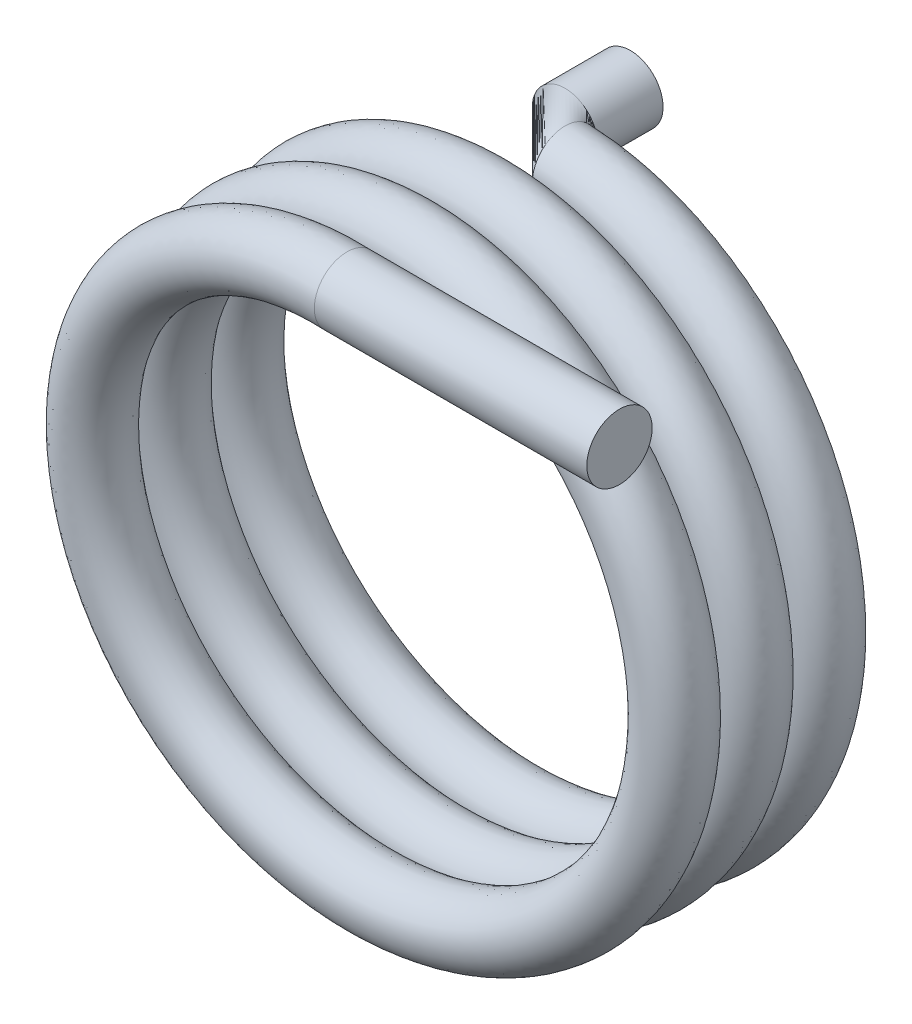
ISO-10303-21;
HEADER;
FILE_DESCRIPTION(('STEP AP214'),'2;1');
FILE_NAME('part.step','',(''),(''),'','','');
FILE_SCHEMA(('AUTOMOTIVE_DESIGN { 1 0 10303 214 1 1 1 1 }'));
ENDSEC;
DATA;
#1=APPLICATION_CONTEXT('core data for automotive mechanical design processes');
#2=APPLICATION_PROTOCOL_DEFINITION('international standard','automotive_design',2000,#1);
#3=PRODUCT_CONTEXT('',#1,'mechanical');
#4=PRODUCT('Part','Part','',(#3));
#5=PRODUCT_RELATED_PRODUCT_CATEGORY('part','',(#4));
#6=PRODUCT_DEFINITION_FORMATION('','',#4);
#7=PRODUCT_DEFINITION_CONTEXT('part definition',#1,'design');
#8=PRODUCT_DEFINITION('design','',#6,#7);
#9=PRODUCT_DEFINITION_SHAPE('','',#8);
#10=(LENGTH_UNIT() NAMED_UNIT(*) SI_UNIT(.MILLI.,.METRE.));
#11=(NAMED_UNIT(*) PLANE_ANGLE_UNIT() SI_UNIT($,.RADIAN.));
#12=(NAMED_UNIT(*) SI_UNIT($,.STERADIAN.) SOLID_ANGLE_UNIT());
#13=UNCERTAINTY_MEASURE_WITH_UNIT(LENGTH_MEASURE(1.E-05),#10,'distance_accuracy_value','');
#14=(GEOMETRIC_REPRESENTATION_CONTEXT(3) GLOBAL_UNCERTAINTY_ASSIGNED_CONTEXT((#13)) GLOBAL_UNIT_ASSIGNED_CONTEXT((#10,
#11,#12)) REPRESENTATION_CONTEXT('',''));
#15=CARTESIAN_POINT('',(0.,0.,0.));
#16=DIRECTION('',(0.,0.,1.));
#17=DIRECTION('',(1.,0.,0.));
#18=AXIS2_PLACEMENT_3D('',#15,#16,#17);
#19=CARTESIAN_POINT('',(0.,0.,-1.8));
#20=CARTESIAN_POINT('',(4.01923788646684,0.,-1.63333333333333));
#21=CARTESIAN_POINT('',(7.5,-2.00961894323342,-1.46666666666667));
#22=CARTESIAN_POINT('',(10.9807621135332,-4.01923788646684,-1.3));
#23=CARTESIAN_POINT('',(12.9903810567666,-7.5,-1.13333333333333));
#24=CARTESIAN_POINT('',(15.,-10.9807621135332,-0.966666666666667));
#25=CARTESIAN_POINT('',(15.,-15.,-0.8));
#26=CARTESIAN_POINT('',(15.,-19.0192378864668,-0.633333333333333));
#27=CARTESIAN_POINT('',(12.9903810567666,-22.5,-0.466666666666667));
#28=CARTESIAN_POINT('',(10.9807621135332,-25.9807621135332,-0.3));
#29=CARTESIAN_POINT('',(7.50000000000001,-27.9903810567666,-0.133333333333333));
#30=CARTESIAN_POINT('',(4.01923788646685,-30.,0.0333333333333333));
#31=CARTESIAN_POINT('',(0.,-30.,0.2));
#32=CARTESIAN_POINT('',(-4.01923788646683,-30.,0.366666666666667));
#33=CARTESIAN_POINT('',(-7.49999999999999,-27.9903810567666,0.533333333333333));
#34=CARTESIAN_POINT('',(-10.9807621135331,-25.9807621135332,0.7));
#35=CARTESIAN_POINT('',(-12.9903810567666,-22.5,0.866666666666667));
#36=CARTESIAN_POINT('',(-15.,-19.0192378864669,1.03333333333333));
#37=CARTESIAN_POINT('',(-15.,-15.,1.2));
#38=CARTESIAN_POINT('',(-15.,-10.9807621135332,1.36666666666667));
#39=CARTESIAN_POINT('',(-12.9903810567666,-7.50000000000001,1.53333333333333));
#40=CARTESIAN_POINT('',(-10.9807621135332,-4.01923788646684,1.7));
#41=CARTESIAN_POINT('',(-7.50000000000001,-2.00961894323343,1.86666666666667));
#42=CARTESIAN_POINT('',(-4.01923788646685,0.,2.03333333333333));
#43=CARTESIAN_POINT('',(0.,0.,2.2));
#44=CARTESIAN_POINT('',(4.01923788646684,0.,2.36666666666667));
#45=CARTESIAN_POINT('',(7.5,-2.00961894323342,2.53333333333333));
#46=CARTESIAN_POINT('',(10.9807621135332,-4.01923788646684,2.7));
#47=CARTESIAN_POINT('',(12.9903810567666,-7.5,2.86666666666667));
#48=CARTESIAN_POINT('',(15.,-10.9807621135332,3.03333333333333));
#49=CARTESIAN_POINT('',(15.,-15.,3.2));
#50=CARTESIAN_POINT('',(15.,-19.0192378864668,3.36666666666667));
#51=CARTESIAN_POINT('',(12.9903810567666,-22.5,3.53333333333333));
#52=CARTESIAN_POINT('',(10.9807621135332,-25.9807621135332,3.7));
#53=CARTESIAN_POINT('',(7.50000000000001,-27.9903810567666,3.86666666666667));
#54=CARTESIAN_POINT('',(4.01923788646685,-30.,4.03333333333333));
#55=CARTESIAN_POINT('',(0.,-30.,4.2));
#56=CARTESIAN_POINT('',(-4.01923788646683,-30.,4.36666666666667));
#57=CARTESIAN_POINT('',(-7.49999999999999,-27.9903810567666,4.53333333333333));
#58=CARTESIAN_POINT('',(-10.9807621135331,-25.9807621135332,4.7));
#59=CARTESIAN_POINT('',(-12.9903810567666,-22.5,4.86666666666667));
#60=CARTESIAN_POINT('',(-15.,-19.0192378864669,5.03333333333333));
#61=CARTESIAN_POINT('',(-15.,-15.,5.2));
#62=CARTESIAN_POINT('',(-15.,-10.9807621135332,5.36666666666667));
#63=CARTESIAN_POINT('',(-12.9903810567666,-7.50000000000001,5.53333333333333));
#64=CARTESIAN_POINT('',(-10.9807621135332,-4.01923788646684,5.7));
#65=CARTESIAN_POINT('',(-7.50000000000001,-2.00961894323343,5.86666666666667));
#66=CARTESIAN_POINT('',(-4.01923788646685,0.,6.03333333333333));
#67=CARTESIAN_POINT('',(0.,0.,6.2));
#68=CARTESIAN_POINT('',(4.01923788646684,0.,6.36666666666667));
#69=CARTESIAN_POINT('',(7.5,-2.00961894323342,6.53333333333333));
#70=CARTESIAN_POINT('',(10.9807621135332,-4.01923788646684,6.7));
#71=CARTESIAN_POINT('',(12.9903810567666,-7.5,6.86666666666667));
#72=CARTESIAN_POINT('',(15.,-10.9807621135332,7.03333333333333));
#73=CARTESIAN_POINT('',(15.,-15.,7.2));
#74=CARTESIAN_POINT('',(15.,-19.0192378864668,7.36666666666667));
#75=CARTESIAN_POINT('',(12.9903810567666,-22.5,7.53333333333333));
#76=CARTESIAN_POINT('',(10.9807621135332,-25.9807621135332,7.7));
#77=CARTESIAN_POINT('',(7.50000000000001,-27.9903810567666,7.86666666666667));
#78=CARTESIAN_POINT('',(4.01923788646685,-30.,8.03333333333333));
#79=CARTESIAN_POINT('',(0.,-30.,8.2));
#80=CARTESIAN_POINT('',(-4.01923788646683,-30.,8.36666666666667));
#81=CARTESIAN_POINT('',(-7.49999999999999,-27.9903810567666,8.53333333333333));
#82=CARTESIAN_POINT('',(-10.9807621135331,-25.9807621135332,8.7));
#83=CARTESIAN_POINT('',(-12.9903810567666,-22.5,8.86666666666667));
#84=CARTESIAN_POINT('',(-15.,-19.0192378864669,9.03333333333333));
#85=CARTESIAN_POINT('',(-15.,-15.,9.2));
#86=CARTESIAN_POINT('',(-15.,-10.9807621135332,9.36666666666667));
#87=CARTESIAN_POINT('',(-12.9903810567666,-7.50000000000001,9.53333333333333));
#88=CARTESIAN_POINT('',(-10.9807621135332,-4.01923788646684,9.7));
#89=CARTESIAN_POINT('',(-7.50000000000001,-2.00961894323343,9.86666666666667));
#90=CARTESIAN_POINT('',(-4.01923788646685,0.,10.0333333333333));
#91=CARTESIAN_POINT('',(0.,0.,10.2));
#92=CARTESIAN_POINT('',(0.,3.6,-1.8));
#93=CARTESIAN_POINT('',(4.98385497921888,3.6,-1.63333333333333));
#94=CARTESIAN_POINT('',(9.3,1.10807251039056,-1.46666666666667));
#95=CARTESIAN_POINT('',(13.6161450207811,-1.38385497921888,-1.3));
#96=CARTESIAN_POINT('',(16.1080725103906,-5.7,-1.13333333333333));
#97=CARTESIAN_POINT('',(18.6,-10.0161450207811,-0.966666666666667));
#98=CARTESIAN_POINT('',(18.6,-15.,-0.8));
#99=CARTESIAN_POINT('',(18.6,-19.9838549792189,-0.633333333333333));
#100=CARTESIAN_POINT('',(16.1080725103906,-24.3,-0.466666666666667));
#101=CARTESIAN_POINT('',(13.6161450207811,-28.6161450207811,-0.3));
#102=CARTESIAN_POINT('',(9.30000000000001,-31.1080725103906,-0.133333333333333));
#103=CARTESIAN_POINT('',(4.98385497921889,-33.6,0.0333333333333333));
#104=CARTESIAN_POINT('',(0.,-33.6,0.2));
#105=CARTESIAN_POINT('',(-4.98385497921887,-33.6,0.366666666666667));
#106=CARTESIAN_POINT('',(-9.29999999999999,-31.1080725103906,0.533333333333333));
#107=CARTESIAN_POINT('',(-13.6161450207811,-28.6161450207811,0.7));
#108=CARTESIAN_POINT('',(-16.1080725103905,-24.3,0.866666666666667));
#109=CARTESIAN_POINT('',(-18.6,-19.9838549792189,1.03333333333333));
#110=CARTESIAN_POINT('',(-18.6,-15.,1.2));
#111=CARTESIAN_POINT('',(-18.6,-10.0161450207811,1.36666666666667));
#112=CARTESIAN_POINT('',(-16.1080725103906,-5.70000000000002,1.53333333333333));
#113=CARTESIAN_POINT('',(-13.6161450207811,-1.38385497921889,1.7));
#114=CARTESIAN_POINT('',(-9.30000000000001,1.10807251039055,1.86666666666667));
#115=CARTESIAN_POINT('',(-4.9838549792189,3.6,2.03333333333333));
#116=CARTESIAN_POINT('',(0.,3.6,2.2));
#117=CARTESIAN_POINT('',(4.98385497921888,3.6,2.36666666666667));
#118=CARTESIAN_POINT('',(9.3,1.10807251039056,2.53333333333333));
#119=CARTESIAN_POINT('',(13.6161450207811,-1.38385497921888,2.7));
#120=CARTESIAN_POINT('',(16.1080725103906,-5.7,2.86666666666667));
#121=CARTESIAN_POINT('',(18.6,-10.0161450207811,3.03333333333333));
#122=CARTESIAN_POINT('',(18.6,-15.,3.2));
#123=CARTESIAN_POINT('',(18.6,-19.9838549792189,3.36666666666667));
#124=CARTESIAN_POINT('',(16.1080725103906,-24.3,3.53333333333333));
#125=CARTESIAN_POINT('',(13.6161450207811,-28.6161450207811,3.7));
#126=CARTESIAN_POINT('',(9.30000000000001,-31.1080725103906,3.86666666666667));
#127=CARTESIAN_POINT('',(4.98385497921889,-33.6,4.03333333333333));
#128=CARTESIAN_POINT('',(0.,-33.6,4.2));
#129=CARTESIAN_POINT('',(-4.98385497921887,-33.6,4.36666666666667));
#130=CARTESIAN_POINT('',(-9.29999999999999,-31.1080725103906,4.53333333333333));
#131=CARTESIAN_POINT('',(-13.6161450207811,-28.6161450207811,4.7));
#132=CARTESIAN_POINT('',(-16.1080725103905,-24.3,4.86666666666667));
#133=CARTESIAN_POINT('',(-18.6,-19.9838549792189,5.03333333333333));
#134=CARTESIAN_POINT('',(-18.6,-15.,5.2));
#135=CARTESIAN_POINT('',(-18.6,-10.0161450207811,5.36666666666667));
#136=CARTESIAN_POINT('',(-16.1080725103906,-5.70000000000002,5.53333333333333));
#137=CARTESIAN_POINT('',(-13.6161450207811,-1.38385497921889,5.7));
#138=CARTESIAN_POINT('',(-9.30000000000001,1.10807251039055,5.86666666666667));
#139=CARTESIAN_POINT('',(-4.9838549792189,3.6,6.03333333333333));
#140=CARTESIAN_POINT('',(0.,3.6,6.2));
#141=CARTESIAN_POINT('',(4.98385497921888,3.6,6.36666666666667));
#142=CARTESIAN_POINT('',(9.3,1.10807251039056,6.53333333333333));
#143=CARTESIAN_POINT('',(13.6161450207811,-1.38385497921888,6.7));
#144=CARTESIAN_POINT('',(16.1080725103906,-5.7,6.86666666666667));
#145=CARTESIAN_POINT('',(18.6,-10.0161450207811,7.03333333333333));
#146=CARTESIAN_POINT('',(18.6,-15.,7.2));
#147=CARTESIAN_POINT('',(18.6,-19.9838549792189,7.36666666666667));
#148=CARTESIAN_POINT('',(16.1080725103906,-24.3,7.53333333333333));
#149=CARTESIAN_POINT('',(13.6161450207811,-28.6161450207811,7.7));
#150=CARTESIAN_POINT('',(9.30000000000001,-31.1080725103906,7.86666666666667));
#151=CARTESIAN_POINT('',(4.98385497921889,-33.6,8.03333333333333));
#152=CARTESIAN_POINT('',(0.,-33.6,8.2));
#153=CARTESIAN_POINT('',(-4.98385497921887,-33.6,8.36666666666667));
#154=CARTESIAN_POINT('',(-9.29999999999999,-31.1080725103906,8.53333333333333));
#155=CARTESIAN_POINT('',(-13.6161450207811,-28.6161450207811,8.7));
#156=CARTESIAN_POINT('',(-16.1080725103905,-24.3,8.86666666666667));
#157=CARTESIAN_POINT('',(-18.6,-19.9838549792189,9.03333333333333));
#158=CARTESIAN_POINT('',(-18.6,-15.,9.2));
#159=CARTESIAN_POINT('',(-18.6,-10.0161450207811,9.36666666666667));
#160=CARTESIAN_POINT('',(-16.1080725103906,-5.70000000000002,9.53333333333333));
#161=CARTESIAN_POINT('',(-13.6161450207811,-1.38385497921889,9.7));
#162=CARTESIAN_POINT('',(-9.30000000000001,1.10807251039055,9.86666666666667));
#163=CARTESIAN_POINT('',(-4.9838549792189,3.6,10.0333333333333));
#164=CARTESIAN_POINT('',(0.,3.6,10.2));
#165=CARTESIAN_POINT('',(0.,3.6,1.8));
#166=CARTESIAN_POINT('',(4.98385497921888,3.6,1.96666666666667));
#167=CARTESIAN_POINT('',(9.3,1.10807251039056,2.13333333333333));
#168=CARTESIAN_POINT('',(13.6161450207811,-1.38385497921888,2.3));
#169=CARTESIAN_POINT('',(16.1080725103906,-5.7,2.46666666666667));
#170=CARTESIAN_POINT('',(18.6,-10.0161450207811,2.63333333333333));
#171=CARTESIAN_POINT('',(18.6,-15.,2.8));
#172=CARTESIAN_POINT('',(18.6,-19.9838549792189,2.96666666666667));
#173=CARTESIAN_POINT('',(16.1080725103906,-24.3,3.13333333333333));
#174=CARTESIAN_POINT('',(13.6161450207811,-28.6161450207811,3.3));
#175=CARTESIAN_POINT('',(9.30000000000001,-31.1080725103906,3.46666666666667));
#176=CARTESIAN_POINT('',(4.98385497921889,-33.6,3.63333333333333));
#177=CARTESIAN_POINT('',(0.,-33.6,3.8));
#178=CARTESIAN_POINT('',(-4.98385497921887,-33.6,3.96666666666667));
#179=CARTESIAN_POINT('',(-9.29999999999999,-31.1080725103906,4.13333333333333));
#180=CARTESIAN_POINT('',(-13.6161450207811,-28.6161450207811,4.3));
#181=CARTESIAN_POINT('',(-16.1080725103905,-24.3,4.46666666666667));
#182=CARTESIAN_POINT('',(-18.6,-19.9838549792189,4.63333333333333));
#183=CARTESIAN_POINT('',(-18.6,-15.,4.8));
#184=CARTESIAN_POINT('',(-18.6,-10.0161450207811,4.96666666666667));
#185=CARTESIAN_POINT('',(-16.1080725103906,-5.70000000000002,5.13333333333333));
#186=CARTESIAN_POINT('',(-13.6161450207811,-1.38385497921889,5.3));
#187=CARTESIAN_POINT('',(-9.30000000000001,1.10807251039055,5.46666666666667));
#188=CARTESIAN_POINT('',(-4.9838549792189,3.6,5.63333333333333));
#189=CARTESIAN_POINT('',(0.,3.6,5.8));
#190=CARTESIAN_POINT('',(4.98385497921888,3.6,5.96666666666667));
#191=CARTESIAN_POINT('',(9.3,1.10807251039056,6.13333333333333));
#192=CARTESIAN_POINT('',(13.6161450207811,-1.38385497921888,6.3));
#193=CARTESIAN_POINT('',(16.1080725103906,-5.7,6.46666666666667));
#194=CARTESIAN_POINT('',(18.6,-10.0161450207811,6.63333333333333));
#195=CARTESIAN_POINT('',(18.6,-15.,6.8));
#196=CARTESIAN_POINT('',(18.6,-19.9838549792189,6.96666666666667));
#197=CARTESIAN_POINT('',(16.1080725103906,-24.3,7.13333333333333));
#198=CARTESIAN_POINT('',(13.6161450207811,-28.6161450207811,7.3));
#199=CARTESIAN_POINT('',(9.30000000000001,-31.1080725103906,7.46666666666667));
#200=CARTESIAN_POINT('',(4.98385497921889,-33.6,7.63333333333333));
#201=CARTESIAN_POINT('',(0.,-33.6,7.8));
#202=CARTESIAN_POINT('',(-4.98385497921887,-33.6,7.96666666666667));
#203=CARTESIAN_POINT('',(-9.29999999999999,-31.1080725103906,8.13333333333333));
#204=CARTESIAN_POINT('',(-13.6161450207811,-28.6161450207811,8.3));
#205=CARTESIAN_POINT('',(-16.1080725103905,-24.3,8.46666666666667));
#206=CARTESIAN_POINT('',(-18.6,-19.9838549792189,8.63333333333333));
#207=CARTESIAN_POINT('',(-18.6,-15.,8.8));
#208=CARTESIAN_POINT('',(-18.6,-10.0161450207811,8.96666666666667));
#209=CARTESIAN_POINT('',(-16.1080725103906,-5.70000000000002,9.13333333333333));
#210=CARTESIAN_POINT('',(-13.6161450207811,-1.38385497921889,9.3));
#211=CARTESIAN_POINT('',(-9.30000000000001,1.10807251039055,9.46666666666667));
#212=CARTESIAN_POINT('',(-4.9838549792189,3.6,9.63333333333333));
#213=CARTESIAN_POINT('',(0.,3.6,9.8));
#214=CARTESIAN_POINT('',(4.98385497921888,3.6,9.96666666666667));
#215=CARTESIAN_POINT('',(9.3,1.10807251039056,10.1333333333333));
#216=CARTESIAN_POINT('',(13.6161450207811,-1.38385497921888,10.3));
#217=CARTESIAN_POINT('',(16.1080725103906,-5.7,10.4666666666667));
#218=CARTESIAN_POINT('',(18.6,-10.0161450207811,10.6333333333333));
#219=CARTESIAN_POINT('',(18.6,-15.,10.8));
#220=CARTESIAN_POINT('',(18.6,-19.9838549792189,10.9666666666667));
#221=CARTESIAN_POINT('',(16.1080725103906,-24.3,11.1333333333333));
#222=CARTESIAN_POINT('',(13.6161450207811,-28.6161450207811,11.3));
#223=CARTESIAN_POINT('',(9.30000000000001,-31.1080725103906,11.4666666666667));
#224=CARTESIAN_POINT('',(4.98385497921889,-33.6,11.6333333333333));
#225=CARTESIAN_POINT('',(0.,-33.6,11.8));
#226=CARTESIAN_POINT('',(-4.98385497921887,-33.6,11.9666666666667));
#227=CARTESIAN_POINT('',(-9.29999999999999,-31.1080725103906,12.1333333333333));
#228=CARTESIAN_POINT('',(-13.6161450207811,-28.6161450207811,12.3));
#229=CARTESIAN_POINT('',(-16.1080725103905,-24.3,12.4666666666667));
#230=CARTESIAN_POINT('',(-18.6,-19.9838549792189,12.6333333333333));
#231=CARTESIAN_POINT('',(-18.6,-15.,12.8));
#232=CARTESIAN_POINT('',(-18.6,-10.0161450207811,12.9666666666667));
#233=CARTESIAN_POINT('',(-16.1080725103906,-5.70000000000002,13.1333333333333));
#234=CARTESIAN_POINT('',(-13.6161450207811,-1.38385497921889,13.3));
#235=CARTESIAN_POINT('',(-9.30000000000001,1.10807251039055,13.4666666666667));
#236=CARTESIAN_POINT('',(-4.9838549792189,3.6,13.6333333333333));
#237=CARTESIAN_POINT('',(0.,3.6,13.8));
#238=CARTESIAN_POINT('',(0.,0.,1.8));
#239=CARTESIAN_POINT('',(4.01923788646684,0.,1.96666666666667));
#240=CARTESIAN_POINT('',(7.5,-2.00961894323342,2.13333333333333));
#241=CARTESIAN_POINT('',(10.9807621135332,-4.01923788646684,2.3));
#242=CARTESIAN_POINT('',(12.9903810567666,-7.5,2.46666666666667));
#243=CARTESIAN_POINT('',(15.,-10.9807621135332,2.63333333333333));
#244=CARTESIAN_POINT('',(15.,-15.,2.8));
#245=CARTESIAN_POINT('',(15.,-19.0192378864668,2.96666666666667));
#246=CARTESIAN_POINT('',(12.9903810567666,-22.5,3.13333333333333));
#247=CARTESIAN_POINT('',(10.9807621135332,-25.9807621135332,3.3));
#248=CARTESIAN_POINT('',(7.50000000000001,-27.9903810567666,3.46666666666667));
#249=CARTESIAN_POINT('',(4.01923788646685,-30.,3.63333333333333));
#250=CARTESIAN_POINT('',(0.,-30.,3.8));
#251=CARTESIAN_POINT('',(-4.01923788646683,-30.,3.96666666666667));
#252=CARTESIAN_POINT('',(-7.49999999999999,-27.9903810567666,4.13333333333333));
#253=CARTESIAN_POINT('',(-10.9807621135331,-25.9807621135332,4.3));
#254=CARTESIAN_POINT('',(-12.9903810567666,-22.5,4.46666666666667));
#255=CARTESIAN_POINT('',(-15.,-19.0192378864669,4.63333333333333));
#256=CARTESIAN_POINT('',(-15.,-15.,4.8));
#257=CARTESIAN_POINT('',(-15.,-10.9807621135332,4.96666666666667));
#258=CARTESIAN_POINT('',(-12.9903810567666,-7.50000000000001,5.13333333333333));
#259=CARTESIAN_POINT('',(-10.9807621135332,-4.01923788646684,5.3));
#260=CARTESIAN_POINT('',(-7.50000000000001,-2.00961894323343,5.46666666666667));
#261=CARTESIAN_POINT('',(-4.01923788646685,0.,5.63333333333333));
#262=CARTESIAN_POINT('',(0.,0.,5.8));
#263=CARTESIAN_POINT('',(4.01923788646684,0.,5.96666666666667));
#264=CARTESIAN_POINT('',(7.5,-2.00961894323342,6.13333333333333));
#265=CARTESIAN_POINT('',(10.9807621135332,-4.01923788646684,6.3));
#266=CARTESIAN_POINT('',(12.9903810567666,-7.5,6.46666666666667));
#267=CARTESIAN_POINT('',(15.,-10.9807621135332,6.63333333333333));
#268=CARTESIAN_POINT('',(15.,-15.,6.8));
#269=CARTESIAN_POINT('',(15.,-19.0192378864668,6.96666666666667));
#270=CARTESIAN_POINT('',(12.9903810567666,-22.5,7.13333333333333));
#271=CARTESIAN_POINT('',(10.9807621135332,-25.9807621135332,7.3));
#272=CARTESIAN_POINT('',(7.50000000000001,-27.9903810567666,7.46666666666667));
#273=CARTESIAN_POINT('',(4.01923788646685,-30.,7.63333333333333));
#274=CARTESIAN_POINT('',(0.,-30.,7.8));
#275=CARTESIAN_POINT('',(-4.01923788646683,-30.,7.96666666666667));
#276=CARTESIAN_POINT('',(-7.49999999999999,-27.9903810567666,8.13333333333333));
#277=CARTESIAN_POINT('',(-10.9807621135331,-25.9807621135332,8.3));
#278=CARTESIAN_POINT('',(-12.9903810567666,-22.5,8.46666666666667));
#279=CARTESIAN_POINT('',(-15.,-19.0192378864669,8.63333333333333));
#280=CARTESIAN_POINT('',(-15.,-15.,8.8));
#281=CARTESIAN_POINT('',(-15.,-10.9807621135332,8.96666666666667));
#282=CARTESIAN_POINT('',(-12.9903810567666,-7.50000000000001,9.13333333333333));
#283=CARTESIAN_POINT('',(-10.9807621135332,-4.01923788646684,9.3));
#284=CARTESIAN_POINT('',(-7.50000000000001,-2.00961894323343,9.46666666666667));
#285=CARTESIAN_POINT('',(-4.01923788646685,0.,9.63333333333333));
#286=CARTESIAN_POINT('',(0.,0.,9.8));
#287=CARTESIAN_POINT('',(4.01923788646684,0.,9.96666666666667));
#288=CARTESIAN_POINT('',(7.5,-2.00961894323342,10.1333333333333));
#289=CARTESIAN_POINT('',(10.9807621135332,-4.01923788646684,10.3));
#290=CARTESIAN_POINT('',(12.9903810567666,-7.5,10.4666666666667));
#291=CARTESIAN_POINT('',(15.,-10.9807621135332,10.6333333333333));
#292=CARTESIAN_POINT('',(15.,-15.,10.8));
#293=CARTESIAN_POINT('',(15.,-19.0192378864668,10.9666666666667));
#294=CARTESIAN_POINT('',(12.9903810567666,-22.5,11.1333333333333));
#295=CARTESIAN_POINT('',(10.9807621135332,-25.9807621135332,11.3));
#296=CARTESIAN_POINT('',(7.50000000000001,-27.9903810567666,11.4666666666667));
#297=CARTESIAN_POINT('',(4.01923788646685,-30.,11.6333333333333));
#298=CARTESIAN_POINT('',(0.,-30.,11.8));
#299=CARTESIAN_POINT('',(-4.01923788646683,-30.,11.9666666666667));
#300=CARTESIAN_POINT('',(-7.49999999999999,-27.9903810567666,12.1333333333333));
#301=CARTESIAN_POINT('',(-10.9807621135331,-25.9807621135332,12.3));
#302=CARTESIAN_POINT('',(-12.9903810567666,-22.5,12.4666666666667));
#303=CARTESIAN_POINT('',(-15.,-19.0192378864669,12.6333333333333));
#304=CARTESIAN_POINT('',(-15.,-15.,12.8));
#305=CARTESIAN_POINT('',(-15.,-10.9807621135332,12.9666666666667));
#306=CARTESIAN_POINT('',(-12.9903810567666,-7.50000000000001,13.1333333333333));
#307=CARTESIAN_POINT('',(-10.9807621135332,-4.01923788646684,13.3));
#308=CARTESIAN_POINT('',(-7.50000000000001,-2.00961894323343,13.4666666666667));
#309=CARTESIAN_POINT('',(-4.01923788646685,0.,13.6333333333333));
#310=CARTESIAN_POINT('',(0.,0.,13.8));
#311=CARTESIAN_POINT('',(0.,-3.6,1.8));
#312=CARTESIAN_POINT('',(3.0546207937148,-3.6,1.96666666666667));
#313=CARTESIAN_POINT('',(5.7,-5.1273103968574,2.13333333333333));
#314=CARTESIAN_POINT('',(8.3453792062852,-6.6546207937148,2.3));
#315=CARTESIAN_POINT('',(9.8726896031426,-9.3,2.46666666666667));
#316=CARTESIAN_POINT('',(11.4,-11.9453792062852,2.63333333333333));
#317=CARTESIAN_POINT('',(11.4,-15.,2.8));
#318=CARTESIAN_POINT('',(11.4,-18.0546207937148,2.96666666666667));
#319=CARTESIAN_POINT('',(9.87268960314261,-20.7,3.13333333333333));
#320=CARTESIAN_POINT('',(8.3453792062852,-23.3453792062852,3.3));
#321=CARTESIAN_POINT('',(5.70000000000001,-24.8726896031426,3.46666666666667));
#322=CARTESIAN_POINT('',(3.05462079371481,-26.4,3.63333333333333));
#323=CARTESIAN_POINT('',(0.,-26.4,3.8));
#324=CARTESIAN_POINT('',(-3.05462079371479,-26.4,3.96666666666667));
#325=CARTESIAN_POINT('',(-5.69999999999999,-24.8726896031426,4.13333333333333));
#326=CARTESIAN_POINT('',(-8.34537920628519,-23.3453792062852,4.3));
#327=CARTESIAN_POINT('',(-9.87268960314259,-20.7,4.46666666666667));
#328=CARTESIAN_POINT('',(-11.4,-18.0546207937148,4.63333333333333));
#329=CARTESIAN_POINT('',(-11.4,-15.,4.8));
#330=CARTESIAN_POINT('',(-11.4,-11.9453792062852,4.96666666666667));
#331=CARTESIAN_POINT('',(-9.8726896031426,-9.30000000000001,5.13333333333333));
#332=CARTESIAN_POINT('',(-8.3453792062852,-6.6546207937148,5.3));
#333=CARTESIAN_POINT('',(-5.70000000000001,-5.1273103968574,5.46666666666667));
#334=CARTESIAN_POINT('',(-3.05462079371481,-3.6,5.63333333333333));
#335=CARTESIAN_POINT('',(0.,-3.6,5.8));
#336=CARTESIAN_POINT('',(3.0546207937148,-3.6,5.96666666666667));
#337=CARTESIAN_POINT('',(5.7,-5.1273103968574,6.13333333333333));
#338=CARTESIAN_POINT('',(8.3453792062852,-6.6546207937148,6.3));
#339=CARTESIAN_POINT('',(9.8726896031426,-9.3,6.46666666666667));
#340=CARTESIAN_POINT('',(11.4,-11.9453792062852,6.63333333333333));
#341=CARTESIAN_POINT('',(11.4,-15.,6.8));
#342=CARTESIAN_POINT('',(11.4,-18.0546207937148,6.96666666666667));
#343=CARTESIAN_POINT('',(9.87268960314261,-20.7,7.13333333333333));
#344=CARTESIAN_POINT('',(8.3453792062852,-23.3453792062852,7.3));
#345=CARTESIAN_POINT('',(5.70000000000001,-24.8726896031426,7.46666666666667));
#346=CARTESIAN_POINT('',(3.05462079371481,-26.4,7.63333333333333));
#347=CARTESIAN_POINT('',(0.,-26.4,7.8));
#348=CARTESIAN_POINT('',(-3.05462079371479,-26.4,7.96666666666667));
#349=CARTESIAN_POINT('',(-5.69999999999999,-24.8726896031426,8.13333333333333));
#350=CARTESIAN_POINT('',(-8.34537920628519,-23.3453792062852,8.3));
#351=CARTESIAN_POINT('',(-9.87268960314259,-20.7,8.46666666666667));
#352=CARTESIAN_POINT('',(-11.4,-18.0546207937148,8.63333333333333));
#353=CARTESIAN_POINT('',(-11.4,-15.,8.8));
#354=CARTESIAN_POINT('',(-11.4,-11.9453792062852,8.96666666666667));
#355=CARTESIAN_POINT('',(-9.8726896031426,-9.30000000000001,9.13333333333333));
#356=CARTESIAN_POINT('',(-8.3453792062852,-6.6546207937148,9.3));
#357=CARTESIAN_POINT('',(-5.70000000000001,-5.1273103968574,9.46666666666667));
#358=CARTESIAN_POINT('',(-3.05462079371481,-3.6,9.63333333333333));
#359=CARTESIAN_POINT('',(0.,-3.6,9.8));
#360=CARTESIAN_POINT('',(3.0546207937148,-3.6,9.96666666666667));
#361=CARTESIAN_POINT('',(5.7,-5.1273103968574,10.1333333333333));
#362=CARTESIAN_POINT('',(8.3453792062852,-6.6546207937148,10.3));
#363=CARTESIAN_POINT('',(9.8726896031426,-9.3,10.4666666666667));
#364=CARTESIAN_POINT('',(11.4,-11.9453792062852,10.6333333333333));
#365=CARTESIAN_POINT('',(11.4,-15.,10.8));
#366=CARTESIAN_POINT('',(11.4,-18.0546207937148,10.9666666666667));
#367=CARTESIAN_POINT('',(9.87268960314261,-20.7,11.1333333333333));
#368=CARTESIAN_POINT('',(8.3453792062852,-23.3453792062852,11.3));
#369=CARTESIAN_POINT('',(5.70000000000001,-24.8726896031426,11.4666666666667));
#370=CARTESIAN_POINT('',(3.05462079371481,-26.4,11.6333333333333));
#371=CARTESIAN_POINT('',(0.,-26.4,11.8));
#372=CARTESIAN_POINT('',(-3.05462079371479,-26.4,11.9666666666667));
#373=CARTESIAN_POINT('',(-5.69999999999999,-24.8726896031426,12.1333333333333));
#374=CARTESIAN_POINT('',(-8.34537920628519,-23.3453792062852,12.3));
#375=CARTESIAN_POINT('',(-9.87268960314259,-20.7,12.4666666666667));
#376=CARTESIAN_POINT('',(-11.4,-18.0546207937148,12.6333333333333));
#377=CARTESIAN_POINT('',(-11.4,-15.,12.8));
#378=CARTESIAN_POINT('',(-11.4,-11.9453792062852,12.9666666666667));
#379=CARTESIAN_POINT('',(-9.8726896031426,-9.30000000000001,13.1333333333333));
#380=CARTESIAN_POINT('',(-8.3453792062852,-6.6546207937148,13.3));
#381=CARTESIAN_POINT('',(-5.70000000000001,-5.1273103968574,13.4666666666667));
#382=CARTESIAN_POINT('',(-3.05462079371481,-3.6,13.6333333333333));
#383=CARTESIAN_POINT('',(0.,-3.6,13.8));
#384=CARTESIAN_POINT('',(0.,-3.6,-1.8));
#385=CARTESIAN_POINT('',(3.0546207937148,-3.6,-1.63333333333333));
#386=CARTESIAN_POINT('',(5.7,-5.1273103968574,-1.46666666666667));
#387=CARTESIAN_POINT('',(8.3453792062852,-6.6546207937148,-1.3));
#388=CARTESIAN_POINT('',(9.8726896031426,-9.3,-1.13333333333333));
#389=CARTESIAN_POINT('',(11.4,-11.9453792062852,-0.966666666666667));
#390=CARTESIAN_POINT('',(11.4,-15.,-0.8));
#391=CARTESIAN_POINT('',(11.4,-18.0546207937148,-0.633333333333333));
#392=CARTESIAN_POINT('',(9.87268960314261,-20.7,-0.466666666666667));
#393=CARTESIAN_POINT('',(8.3453792062852,-23.3453792062852,-0.3));
#394=CARTESIAN_POINT('',(5.70000000000001,-24.8726896031426,-0.133333333333333));
#395=CARTESIAN_POINT('',(3.05462079371481,-26.4,0.0333333333333333));
#396=CARTESIAN_POINT('',(0.,-26.4,0.2));
#397=CARTESIAN_POINT('',(-3.05462079371479,-26.4,0.366666666666667));
#398=CARTESIAN_POINT('',(-5.69999999999999,-24.8726896031426,0.533333333333333));
#399=CARTESIAN_POINT('',(-8.34537920628519,-23.3453792062852,0.7));
#400=CARTESIAN_POINT('',(-9.87268960314259,-20.7,0.866666666666667));
#401=CARTESIAN_POINT('',(-11.4,-18.0546207937148,1.03333333333333));
#402=CARTESIAN_POINT('',(-11.4,-15.,1.2));
#403=CARTESIAN_POINT('',(-11.4,-11.9453792062852,1.36666666666667));
#404=CARTESIAN_POINT('',(-9.8726896031426,-9.30000000000001,1.53333333333333));
#405=CARTESIAN_POINT('',(-8.3453792062852,-6.6546207937148,1.7));
#406=CARTESIAN_POINT('',(-5.70000000000001,-5.1273103968574,1.86666666666667));
#407=CARTESIAN_POINT('',(-3.05462079371481,-3.6,2.03333333333333));
#408=CARTESIAN_POINT('',(0.,-3.6,2.2));
#409=CARTESIAN_POINT('',(3.0546207937148,-3.6,2.36666666666667));
#410=CARTESIAN_POINT('',(5.7,-5.1273103968574,2.53333333333333));
#411=CARTESIAN_POINT('',(8.3453792062852,-6.6546207937148,2.7));
#412=CARTESIAN_POINT('',(9.8726896031426,-9.3,2.86666666666667));
#413=CARTESIAN_POINT('',(11.4,-11.9453792062852,3.03333333333333));
#414=CARTESIAN_POINT('',(11.4,-15.,3.2));
#415=CARTESIAN_POINT('',(11.4,-18.0546207937148,3.36666666666667));
#416=CARTESIAN_POINT('',(9.87268960314261,-20.7,3.53333333333333));
#417=CARTESIAN_POINT('',(8.3453792062852,-23.3453792062852,3.7));
#418=CARTESIAN_POINT('',(5.70000000000001,-24.8726896031426,3.86666666666667));
#419=CARTESIAN_POINT('',(3.05462079371481,-26.4,4.03333333333333));
#420=CARTESIAN_POINT('',(0.,-26.4,4.2));
#421=CARTESIAN_POINT('',(-3.05462079371479,-26.4,4.36666666666667));
#422=CARTESIAN_POINT('',(-5.69999999999999,-24.8726896031426,4.53333333333333));
#423=CARTESIAN_POINT('',(-8.34537920628519,-23.3453792062852,4.7));
#424=CARTESIAN_POINT('',(-9.87268960314259,-20.7,4.86666666666667));
#425=CARTESIAN_POINT('',(-11.4,-18.0546207937148,5.03333333333333));
#426=CARTESIAN_POINT('',(-11.4,-15.,5.2));
#427=CARTESIAN_POINT('',(-11.4,-11.9453792062852,5.36666666666667));
#428=CARTESIAN_POINT('',(-9.8726896031426,-9.30000000000001,5.53333333333333));
#429=CARTESIAN_POINT('',(-8.3453792062852,-6.6546207937148,5.7));
#430=CARTESIAN_POINT('',(-5.70000000000001,-5.1273103968574,5.86666666666667));
#431=CARTESIAN_POINT('',(-3.05462079371481,-3.6,6.03333333333333));
#432=CARTESIAN_POINT('',(0.,-3.6,6.2));
#433=CARTESIAN_POINT('',(3.0546207937148,-3.6,6.36666666666667));
#434=CARTESIAN_POINT('',(5.7,-5.1273103968574,6.53333333333333));
#435=CARTESIAN_POINT('',(8.3453792062852,-6.6546207937148,6.7));
#436=CARTESIAN_POINT('',(9.8726896031426,-9.3,6.86666666666667));
#437=CARTESIAN_POINT('',(11.4,-11.9453792062852,7.03333333333333));
#438=CARTESIAN_POINT('',(11.4,-15.,7.2));
#439=CARTESIAN_POINT('',(11.4,-18.0546207937148,7.36666666666667));
#440=CARTESIAN_POINT('',(9.87268960314261,-20.7,7.53333333333333));
#441=CARTESIAN_POINT('',(8.3453792062852,-23.3453792062852,7.7));
#442=CARTESIAN_POINT('',(5.70000000000001,-24.8726896031426,7.86666666666667));
#443=CARTESIAN_POINT('',(3.05462079371481,-26.4,8.03333333333333));
#444=CARTESIAN_POINT('',(0.,-26.4,8.2));
#445=CARTESIAN_POINT('',(-3.05462079371479,-26.4,8.36666666666667));
#446=CARTESIAN_POINT('',(-5.69999999999999,-24.8726896031426,8.53333333333333));
#447=CARTESIAN_POINT('',(-8.34537920628519,-23.3453792062852,8.7));
#448=CARTESIAN_POINT('',(-9.87268960314259,-20.7,8.86666666666667));
#449=CARTESIAN_POINT('',(-11.4,-18.0546207937148,9.03333333333333));
#450=CARTESIAN_POINT('',(-11.4,-15.,9.2));
#451=CARTESIAN_POINT('',(-11.4,-11.9453792062852,9.36666666666667));
#452=CARTESIAN_POINT('',(-9.8726896031426,-9.30000000000001,9.53333333333333));
#453=CARTESIAN_POINT('',(-8.3453792062852,-6.6546207937148,9.7));
#454=CARTESIAN_POINT('',(-5.70000000000001,-5.1273103968574,9.86666666666667));
#455=CARTESIAN_POINT('',(-3.05462079371481,-3.6,10.0333333333333));
#456=CARTESIAN_POINT('',(0.,-3.6,10.2));
#457=CARTESIAN_POINT('',(0.,0.,-1.8));
#458=CARTESIAN_POINT('',(4.01923788646684,0.,-1.63333333333333));
#459=CARTESIAN_POINT('',(7.5,-2.00961894323342,-1.46666666666667));
#460=CARTESIAN_POINT('',(10.9807621135332,-4.01923788646684,-1.3));
#461=CARTESIAN_POINT('',(12.9903810567666,-7.5,-1.13333333333333));
#462=CARTESIAN_POINT('',(15.,-10.9807621135332,-0.966666666666667));
#463=CARTESIAN_POINT('',(15.,-15.,-0.8));
#464=CARTESIAN_POINT('',(15.,-19.0192378864668,-0.633333333333333));
#465=CARTESIAN_POINT('',(12.9903810567666,-22.5,-0.466666666666667));
#466=CARTESIAN_POINT('',(10.9807621135332,-25.9807621135332,-0.3));
#467=CARTESIAN_POINT('',(7.50000000000001,-27.9903810567666,-0.133333333333333));
#468=CARTESIAN_POINT('',(4.01923788646685,-30.,0.0333333333333333));
#469=CARTESIAN_POINT('',(0.,-30.,0.2));
#470=CARTESIAN_POINT('',(-4.01923788646683,-30.,0.366666666666667));
#471=CARTESIAN_POINT('',(-7.49999999999999,-27.9903810567666,0.533333333333333));
#472=CARTESIAN_POINT('',(-10.9807621135331,-25.9807621135332,0.7));
#473=CARTESIAN_POINT('',(-12.9903810567666,-22.5,0.866666666666667));
#474=CARTESIAN_POINT('',(-15.,-19.0192378864669,1.03333333333333));
#475=CARTESIAN_POINT('',(-15.,-15.,1.2));
#476=CARTESIAN_POINT('',(-15.,-10.9807621135332,1.36666666666667));
#477=CARTESIAN_POINT('',(-12.9903810567666,-7.50000000000001,1.53333333333333));
#478=CARTESIAN_POINT('',(-10.9807621135332,-4.01923788646684,1.7));
#479=CARTESIAN_POINT('',(-7.50000000000001,-2.00961894323343,1.86666666666667));
#480=CARTESIAN_POINT('',(-4.01923788646685,0.,2.03333333333333));
#481=CARTESIAN_POINT('',(0.,0.,2.2));
#482=CARTESIAN_POINT('',(4.01923788646684,0.,2.36666666666667));
#483=CARTESIAN_POINT('',(7.5,-2.00961894323342,2.53333333333333));
#484=CARTESIAN_POINT('',(10.9807621135332,-4.01923788646684,2.7));
#485=CARTESIAN_POINT('',(12.9903810567666,-7.5,2.86666666666667));
#486=CARTESIAN_POINT('',(15.,-10.9807621135332,3.03333333333333));
#487=CARTESIAN_POINT('',(15.,-15.,3.2));
#488=CARTESIAN_POINT('',(15.,-19.0192378864668,3.36666666666667));
#489=CARTESIAN_POINT('',(12.9903810567666,-22.5,3.53333333333333));
#490=CARTESIAN_POINT('',(10.9807621135332,-25.9807621135332,3.7));
#491=CARTESIAN_POINT('',(7.50000000000001,-27.9903810567666,3.86666666666667));
#492=CARTESIAN_POINT('',(4.01923788646685,-30.,4.03333333333333));
#493=CARTESIAN_POINT('',(0.,-30.,4.2));
#494=CARTESIAN_POINT('',(-4.01923788646683,-30.,4.36666666666667));
#495=CARTESIAN_POINT('',(-7.49999999999999,-27.9903810567666,4.53333333333333));
#496=CARTESIAN_POINT('',(-10.9807621135331,-25.9807621135332,4.7));
#497=CARTESIAN_POINT('',(-12.9903810567666,-22.5,4.86666666666667));
#498=CARTESIAN_POINT('',(-15.,-19.0192378864669,5.03333333333333));
#499=CARTESIAN_POINT('',(-15.,-15.,5.2));
#500=CARTESIAN_POINT('',(-15.,-10.9807621135332,5.36666666666667));
#501=CARTESIAN_POINT('',(-12.9903810567666,-7.50000000000001,5.53333333333333));
#502=CARTESIAN_POINT('',(-10.9807621135332,-4.01923788646684,5.7));
#503=CARTESIAN_POINT('',(-7.50000000000001,-2.00961894323343,5.86666666666667));
#504=CARTESIAN_POINT('',(-4.01923788646685,0.,6.03333333333333));
#505=CARTESIAN_POINT('',(0.,0.,6.2));
#506=CARTESIAN_POINT('',(4.01923788646684,0.,6.36666666666667));
#507=CARTESIAN_POINT('',(7.5,-2.00961894323342,6.53333333333333));
#508=CARTESIAN_POINT('',(10.9807621135332,-4.01923788646684,6.7));
#509=CARTESIAN_POINT('',(12.9903810567666,-7.5,6.86666666666667));
#510=CARTESIAN_POINT('',(15.,-10.9807621135332,7.03333333333333));
#511=CARTESIAN_POINT('',(15.,-15.,7.2));
#512=CARTESIAN_POINT('',(15.,-19.0192378864668,7.36666666666667));
#513=CARTESIAN_POINT('',(12.9903810567666,-22.5,7.53333333333333));
#514=CARTESIAN_POINT('',(10.9807621135332,-25.9807621135332,7.7));
#515=CARTESIAN_POINT('',(7.50000000000001,-27.9903810567666,7.86666666666667));
#516=CARTESIAN_POINT('',(4.01923788646685,-30.,8.03333333333333));
#517=CARTESIAN_POINT('',(0.,-30.,8.2));
#518=CARTESIAN_POINT('',(-4.01923788646683,-30.,8.36666666666667));
#519=CARTESIAN_POINT('',(-7.49999999999999,-27.9903810567666,8.53333333333333));
#520=CARTESIAN_POINT('',(-10.9807621135331,-25.9807621135332,8.7));
#521=CARTESIAN_POINT('',(-12.9903810567666,-22.5,8.86666666666667));
#522=CARTESIAN_POINT('',(-15.,-19.0192378864669,9.03333333333333));
#523=CARTESIAN_POINT('',(-15.,-15.,9.2));
#524=CARTESIAN_POINT('',(-15.,-10.9807621135332,9.36666666666667));
#525=CARTESIAN_POINT('',(-12.9903810567666,-7.50000000000001,9.53333333333333));
#526=CARTESIAN_POINT('',(-10.9807621135332,-4.01923788646684,9.7));
#527=CARTESIAN_POINT('',(-7.50000000000001,-2.00961894323343,9.86666666666667));
#528=CARTESIAN_POINT('',(-4.01923788646685,0.,10.0333333333333));
#529=CARTESIAN_POINT('',(0.,0.,10.2));
#530=(BOUNDED_SURFACE() B_SPLINE_SURFACE(3,2,((#19,#20,#21,#22,#23,#24,#25,#26,#27,#28,#29,#30,
#31,#32,#33,#34,#35,#36,#37,#38,#39,#40,#41,#42,#43,#44,#45,#46,#47,#48,#49,#50,#51,#52,#53,#54,
#55,#56,#57,#58,#59,#60,#61,#62,#63,#64,#65,#66,#67,#68,#69,#70,#71,#72,#73,#74,#75,#76,#77,#78,
#79,#80,#81,#82,#83,#84,#85,#86,#87,#88,#89,#90,#91),(#92,#93,#94,#95,#96,#97,#98,#99,#100,#101,
#102,#103,#104,#105,#106,#107,#108,#109,#110,#111,#112,#113,#114,#115,#116,#117,#118,#119,#120,
#121,#122,#123,#124,#125,#126,#127,#128,#129,#130,#131,#132,#133,#134,#135,#136,#137,#138,#139,
#140,#141,#142,#143,#144,#145,#146,#147,#148,#149,#150,#151,#152,#153,#154,#155,#156,#157,#158,
#159,#160,#161,#162,#163,#164),(#165,#166,#167,#168,#169,#170,#171,#172,#173,#174,#175,#176,
#177,#178,#179,#180,#181,#182,#183,#184,#185,#186,#187,#188,#189,#190,#191,#192,#193,#194,#195,
#196,#197,#198,#199,#200,#201,#202,#203,#204,#205,#206,#207,#208,#209,#210,#211,#212,#213,#214,
#215,#216,#217,#218,#219,#220,#221,#222,#223,#224,#225,#226,#227,#228,#229,#230,#231,#232,#233,
#234,#235,#236,#237),(#238,#239,#240,#241,#242,#243,#244,#245,#246,#247,#248,#249,#250,#251,
#252,#253,#254,#255,#256,#257,#258,#259,#260,#261,#262,#263,#264,#265,#266,#267,#268,#269,#270,
#271,#272,#273,#274,#275,#276,#277,#278,#279,#280,#281,#282,#283,#284,#285,#286,#287,#288,#289,
#290,#291,#292,#293,#294,#295,#296,#297,#298,#299,#300,#301,#302,#303,#304,#305,#306,#307,#308,
#309,#310),(#311,#312,#313,#314,#315,#316,#317,#318,#319,#320,#321,#322,#323,#324,#325,#326,
#327,#328,#329,#330,#331,#332,#333,#334,#335,#336,#337,#338,#339,#340,#341,#342,#343,#344,#345,
#346,#347,#348,#349,#350,#351,#352,#353,#354,#355,#356,#357,#358,#359,#360,#361,#362,#363,#364,
#365,#366,#367,#368,#369,#370,#371,#372,#373,#374,#375,#376,#377,#378,#379,#380,#381,#382,#383),
(#384,#385,#386,#387,#388,#389,#390,#391,#392,#393,#394,#395,#396,#397,#398,#399,#400,#401,#402,
#403,#404,#405,#406,#407,#408,#409,#410,#411,#412,#413,#414,#415,#416,#417,#418,#419,#420,#421,
#422,#423,#424,#425,#426,#427,#428,#429,#430,#431,#432,#433,#434,#435,#436,#437,#438,#439,#440,
#441,#442,#443,#444,#445,#446,#447,#448,#449,#450,#451,#452,#453,#454,#455,#456),(#457,#458,
#459,#460,#461,#462,#463,#464,#465,#466,#467,#468,#469,#470,#471,#472,#473,#474,#475,#476,#477,
#478,#479,#480,#481,#482,#483,#484,#485,#486,#487,#488,#489,#490,#491,#492,#493,#494,#495,#496,
#497,#498,#499,#500,#501,#502,#503,#504,#505,#506,#507,#508,#509,#510,#511,#512,#513,#514,#515,
#516,#517,#518,#519,#520,#521,#522,#523,#524,#525,#526,#527,#528,#529)),.UNSPECIFIED.,.T.,.F.,
.F.) B_SPLINE_SURFACE_WITH_KNOTS((4,3,4),(3,2,2,2,2,2,2,2,2,2,2,2,2,2,2,2,2,2,2,2,2,2,2,2,2,2,2,
2,2,2,2,2,2,2,2,2,3),(0.,0.5,1.),(0.,0.0277777777777778,0.0555555555555556,0.0833333333333333,
0.111111111111111,0.138888888888889,0.166666666666667,0.194444444444444,0.222222222222222,0.25,
0.277777777777778,0.305555555555556,0.333333333333333,0.361111111111111,0.388888888888889,
0.416666666666667,0.444444444444444,0.472222222222222,0.5,0.527777777777778,0.555555555555556,
0.583333333333333,0.611111111111111,0.638888888888889,0.666666666666667,0.694444444444444,
0.722222222222222,0.75,0.777777777777778,0.805555555555556,0.833333333333333,0.861111111111111,
0.888888888888889,0.916666666666667,0.944444444444444,0.972222222222222,1.),
.UNSPECIFIED.) GEOMETRIC_REPRESENTATION_ITEM() RATIONAL_B_SPLINE_SURFACE(((1.,0.965925826289068,
1.,0.965925826289068,1.,0.965925826289068,1.,0.965925826289068,1.,0.965925826289068,1.,
0.965925826289068,1.,0.965925826289068,1.,0.965925826289068,1.,0.965925826289068,1.,
0.965925826289068,1.,0.965925826289068,1.,0.965925826289068,1.,0.965925826289068,1.,
0.965925826289068,1.,0.965925826289068,1.,0.965925826289068,1.,0.965925826289068,1.,
0.965925826289068,1.,0.965925826289068,1.,0.965925826289068,1.,0.965925826289068,1.,
0.965925826289068,1.,0.965925826289068,1.,0.965925826289068,1.,0.965925826289068,1.,
0.965925826289068,1.,0.965925826289068,1.,0.965925826289068,1.,0.965925826289068,1.,
0.965925826289068,1.,0.965925826289068,1.,0.965925826289068,1.,0.965925826289068,1.,
0.965925826289068,1.,0.965925826289068,1.,0.965925826289068,1.),(0.333333333333333,
0.321975275429689,0.333333333333333,0.321975275429689,0.333333333333333,0.321975275429689,
0.333333333333333,0.321975275429689,0.333333333333333,0.321975275429689,0.333333333333333,
0.321975275429689,0.333333333333333,0.321975275429689,0.333333333333333,0.321975275429689,
0.333333333333333,0.321975275429689,0.333333333333333,0.321975275429689,0.333333333333333,
0.321975275429689,0.333333333333333,0.321975275429689,0.333333333333333,0.321975275429689,
0.333333333333333,0.321975275429689,0.333333333333333,0.321975275429689,0.333333333333333,
0.321975275429689,0.333333333333333,0.321975275429689,0.333333333333333,0.321975275429689,
0.333333333333333,0.321975275429689,0.333333333333333,0.321975275429689,0.333333333333333,
0.321975275429689,0.333333333333333,0.321975275429689,0.333333333333333,0.321975275429689,
0.333333333333333,0.321975275429689,0.333333333333333,0.321975275429689,0.333333333333333,
0.321975275429689,0.333333333333333,0.321975275429689,0.333333333333333,0.321975275429689,
0.333333333333333,0.321975275429689,0.333333333333333,0.321975275429689,0.333333333333333,
0.321975275429689,0.333333333333333,0.321975275429689,0.333333333333333,0.321975275429689,
0.333333333333333,0.321975275429689,0.333333333333333,0.321975275429689,0.333333333333333,
0.321975275429689,0.333333333333333),(0.333333333333333,0.321975275429689,0.333333333333333,
0.321975275429689,0.333333333333333,0.321975275429689,0.333333333333333,0.321975275429689,
0.333333333333333,0.321975275429689,0.333333333333333,0.321975275429689,0.333333333333333,
0.321975275429689,0.333333333333333,0.321975275429689,0.333333333333333,0.321975275429689,
0.333333333333333,0.321975275429689,0.333333333333333,0.321975275429689,0.333333333333333,
0.321975275429689,0.333333333333333,0.321975275429689,0.333333333333333,0.321975275429689,
0.333333333333333,0.321975275429689,0.333333333333333,0.321975275429689,0.333333333333333,
0.321975275429689,0.333333333333333,0.321975275429689,0.333333333333333,0.321975275429689,
0.333333333333333,0.321975275429689,0.333333333333333,0.321975275429689,0.333333333333333,
0.321975275429689,0.333333333333333,0.321975275429689,0.333333333333333,0.321975275429689,
0.333333333333333,0.321975275429689,0.333333333333333,0.321975275429689,0.333333333333333,
0.321975275429689,0.333333333333333,0.321975275429689,0.333333333333333,0.321975275429689,
0.333333333333333,0.321975275429689,0.333333333333333,0.321975275429689,0.333333333333333,
0.321975275429689,0.333333333333333,0.321975275429689,0.333333333333333,0.321975275429689,
0.333333333333333,0.321975275429689,0.333333333333333,0.321975275429689,0.333333333333333),(1.,
0.965925826289068,1.,0.965925826289068,1.,0.965925826289068,1.,0.965925826289068,1.,
0.965925826289068,1.,0.965925826289068,1.,0.965925826289068,1.,0.965925826289068,1.,
0.965925826289068,1.,0.965925826289068,1.,0.965925826289068,1.,0.965925826289068,1.,
0.965925826289068,1.,0.965925826289068,1.,0.965925826289068,1.,0.965925826289068,1.,
0.965925826289068,1.,0.965925826289068,1.,0.965925826289068,1.,0.965925826289068,1.,
0.965925826289068,1.,0.965925826289068,1.,0.965925826289068,1.,0.965925826289068,1.,
0.965925826289068,1.,0.965925826289068,1.,0.965925826289068,1.,0.965925826289068,1.,
0.965925826289068,1.,0.965925826289068,1.,0.965925826289068,1.,0.965925826289068,1.,
0.965925826289068,1.,0.965925826289068,1.,0.965925826289068,1.,0.965925826289068,1.),
(0.333333333333333,0.321975275429689,0.333333333333333,0.321975275429689,0.333333333333333,
0.321975275429689,0.333333333333333,0.321975275429689,0.333333333333333,0.321975275429689,
0.333333333333333,0.321975275429689,0.333333333333333,0.321975275429689,0.333333333333333,
0.321975275429689,0.333333333333333,0.321975275429689,0.333333333333333,0.321975275429689,
0.333333333333333,0.321975275429689,0.333333333333333,0.321975275429689,0.333333333333333,
0.321975275429689,0.333333333333333,0.321975275429689,0.333333333333333,0.321975275429689,
0.333333333333333,0.321975275429689,0.333333333333333,0.321975275429689,0.333333333333333,
0.321975275429689,0.333333333333333,0.321975275429689,0.333333333333333,0.321975275429689,
0.333333333333333,0.321975275429689,0.333333333333333,0.321975275429689,0.333333333333333,
0.321975275429689,0.333333333333333,0.321975275429689,0.333333333333333,0.321975275429689,
0.333333333333333,0.321975275429689,0.333333333333333,0.321975275429689,0.333333333333333,
0.321975275429689,0.333333333333333,0.321975275429689,0.333333333333333,0.321975275429689,
0.333333333333333,0.321975275429689,0.333333333333333,0.321975275429689,0.333333333333333,
0.321975275429689,0.333333333333333,0.321975275429689,0.333333333333333,0.321975275429689,
0.333333333333333,0.321975275429689,0.333333333333333),(0.333333333333333,0.321975275429689,
0.333333333333333,0.321975275429689,0.333333333333333,0.321975275429689,0.333333333333333,
0.321975275429689,0.333333333333333,0.321975275429689,0.333333333333333,0.321975275429689,
0.333333333333333,0.321975275429689,0.333333333333333,0.321975275429689,0.333333333333333,
0.321975275429689,0.333333333333333,0.321975275429689,0.333333333333333,0.321975275429689,
0.333333333333333,0.321975275429689,0.333333333333333,0.321975275429689,0.333333333333333,
0.321975275429689,0.333333333333333,0.321975275429689,0.333333333333333,0.321975275429689,
0.333333333333333,0.321975275429689,0.333333333333333,0.321975275429689,0.333333333333333,
0.321975275429689,0.333333333333333,0.321975275429689,0.333333333333333,0.321975275429689,
0.333333333333333,0.321975275429689,0.333333333333333,0.321975275429689,0.333333333333333,
0.321975275429689,0.333333333333333,0.321975275429689,0.333333333333333,0.321975275429689,
0.333333333333333,0.321975275429689,0.333333333333333,0.321975275429689,0.333333333333333,
0.321975275429689,0.333333333333333,0.321975275429689,0.333333333333333,0.321975275429689,
0.333333333333333,0.321975275429689,0.333333333333333,0.321975275429689,0.333333333333333,
0.321975275429689,0.333333333333333,0.321975275429689,0.333333333333333,0.321975275429689,
0.333333333333333),(1.,0.965925826289068,1.,0.965925826289068,1.,0.965925826289068,1.,
0.965925826289068,1.,0.965925826289068,1.,0.965925826289068,1.,0.965925826289068,1.,
0.965925826289068,1.,0.965925826289068,1.,0.965925826289068,1.,0.965925826289068,1.,
0.965925826289068,1.,0.965925826289068,1.,0.965925826289068,1.,0.965925826289068,1.,
0.965925826289068,1.,0.965925826289068,1.,0.965925826289068,1.,0.965925826289068,1.,
0.965925826289068,1.,0.965925826289068,1.,0.965925826289068,1.,0.965925826289068,1.,
0.965925826289068,1.,0.965925826289068,1.,0.965925826289068,1.,0.965925826289068,1.,
0.965925826289068,1.,0.965925826289068,1.,0.965925826289068,1.,0.965925826289068,1.,
0.965925826289068,1.,0.965925826289068,1.,0.965925826289068,1.,0.965925826289068,1.,
0.965925826289068,1.))) REPRESENTATION_ITEM('') SURFACE());
#531=CARTESIAN_POINT('',(0.,0.,0.));
#532=DIRECTION('',(1.,0.,0.));
#533=DIRECTION('',(0.,0.,-1.));
#534=AXIS2_PLACEMENT_3D('',#531,#532,#533);
#535=CIRCLE('',#534,1.8);
#536=CARTESIAN_POINT('',(0.,0.,-1.8));
#537=VERTEX_POINT('',#536);
#538=EDGE_CURVE('E11',#537,#537,#535,.T.);
#539=CARTESIAN_POINT('',(0.,0.,12.));
#540=DIRECTION('',(1.,0.,0.));
#541=DIRECTION('',(0.,1.,0.));
#542=AXIS2_PLACEMENT_3D('',#539,#540,#541);
#543=CIRCLE('',#542,1.8);
#544=CARTESIAN_POINT('',(0.,1.8,12.));
#545=VERTEX_POINT('',#544);
#546=EDGE_CURVE('E63',#545,#545,#543,.T.);
#547=ORIENTED_EDGE('',*,*,#538,.T.);
#548=EDGE_LOOP('',(#547));
#549=FACE_BOUND('',#548,.T.);
#550=ORIENTED_EDGE('',*,*,#546,.F.);
#551=EDGE_LOOP('',(#550));
#552=FACE_BOUND('',#551,.T.);
#553=ADVANCED_FACE('F34',(#549,#552),#530,.T.);
#554=CARTESIAN_POINT('',(-1.8,0.,-5.4));
#555=DIRECTION('',(0.,0.,-1.));
#556=DIRECTION('',(-1.,0.,0.));
#557=AXIS2_PLACEMENT_3D('',#554,#555,#556);
#558=PLANE('',#557);
#559=CARTESIAN_POINT('',(-1.8,0.,-5.4));
#560=DIRECTION('',(0.,0.,-1.));
#561=DIRECTION('',(-1.,0.,0.));
#562=AXIS2_PLACEMENT_3D('',#559,#560,#561);
#563=CIRCLE('',#562,1.8);
#564=CARTESIAN_POINT('',(-3.6,0.,-5.4));
#565=VERTEX_POINT('',#564);
#566=EDGE_CURVE('E44',#565,#565,#563,.T.);
#567=ORIENTED_EDGE('',*,*,#566,.T.);
#568=EDGE_LOOP('',(#567));
#569=FACE_BOUND('',#568,.T.);
#570=ADVANCED_FACE('F73',(#569),#558,.T.);
#571=CARTESIAN_POINT('',(0.,0.,-1.8));
#572=DIRECTION('',(0.,-1.,0.));
#573=DIRECTION('',(0.,0.,-1.));
#574=AXIS2_PLACEMENT_3D('',#571,#572,#573);
#575=DEGENERATE_TOROIDAL_SURFACE('',#574,1.8,1.8,.T.);
#576=CARTESIAN_POINT('',(-1.8,0.,-1.8));
#577=DIRECTION('',(0.,0.,-1.));
#578=DIRECTION('',(-1.,0.,0.));
#579=AXIS2_PLACEMENT_3D('',#576,#577,#578);
#580=CIRCLE('',#579,1.8);
#581=EDGE_CURVE('E57',#537,#537,#580,.T.);
#582=ORIENTED_EDGE('',*,*,#581,.F.);
#583=ORIENTED_EDGE('',*,*,#538,.F.);
#584=EDGE_LOOP('',(#582,#583));
#585=FACE_BOUND('',#584,.T.);
#586=ADVANCED_FACE('F56',(#585),#575,.T.);
#587=CARTESIAN_POINT('',(-1.8,0.,-1.8));
#588=DIRECTION('',(0.,0.,-1.));
#589=DIRECTION('',(-1.,0.,0.));
#590=AXIS2_PLACEMENT_3D('',#587,#588,#589);
#591=CYLINDRICAL_SURFACE('',#590,1.8);
#592=ORIENTED_EDGE('',*,*,#566,.F.);
#593=EDGE_LOOP('',(#592));
#594=FACE_BOUND('',#593,.T.);
#595=ORIENTED_EDGE('',*,*,#581,.T.);
#596=EDGE_LOOP('',(#595));
#597=FACE_BOUND('',#596,.T.);
#598=ADVANCED_FACE('F59',(#594,#597),#591,.T.);
#599=CARTESIAN_POINT('',(15.,0.,12.));
#600=DIRECTION('',(-1.,0.,0.));
#601=DIRECTION('',(0.,-1.,0.));
#602=AXIS2_PLACEMENT_3D('',#599,#600,#601);
#603=CYLINDRICAL_SURFACE('',#602,1.8);
#604=CARTESIAN_POINT('',(15.,0.,12.));
#605=DIRECTION('',(1.,0.,0.));
#606=DIRECTION('',(0.,1.,0.));
#607=AXIS2_PLACEMENT_3D('',#604,#605,#606);
#608=CIRCLE('',#607,1.8);
#609=CARTESIAN_POINT('',(15.,1.8,12.));
#610=VERTEX_POINT('',#609);
#611=EDGE_CURVE('E60',#610,#610,#608,.T.);
#612=ORIENTED_EDGE('',*,*,#611,.F.);
#613=EDGE_LOOP('',(#612));
#614=FACE_BOUND('',#613,.T.);
#615=ORIENTED_EDGE('',*,*,#546,.T.);
#616=EDGE_LOOP('',(#615));
#617=FACE_BOUND('',#616,.T.);
#618=ADVANCED_FACE('F71',(#614,#617),#603,.T.);
#619=CARTESIAN_POINT('',(15.,0.,12.));
#620=DIRECTION('',(1.,0.,0.));
#621=DIRECTION('',(0.,1.,0.));
#622=AXIS2_PLACEMENT_3D('',#619,#620,#621);
#623=PLANE('',#622);
#624=ORIENTED_EDGE('',*,*,#611,.T.);
#625=EDGE_LOOP('',(#624));
#626=FACE_BOUND('',#625,.T.);
#627=ADVANCED_FACE('F84',(#626),#623,.T.);
#628=CLOSED_SHELL('',(#553,#570,#586,#598,#618,#627));
#629=MANIFOLD_SOLID_BREP('B2',#628);
#630=ADVANCED_BREP_SHAPE_REPRESENTATION('',(#18,#629),#14);
#631=SHAPE_DEFINITION_REPRESENTATION(#9,#630);
ENDSEC;
END-ISO-10303-21;
